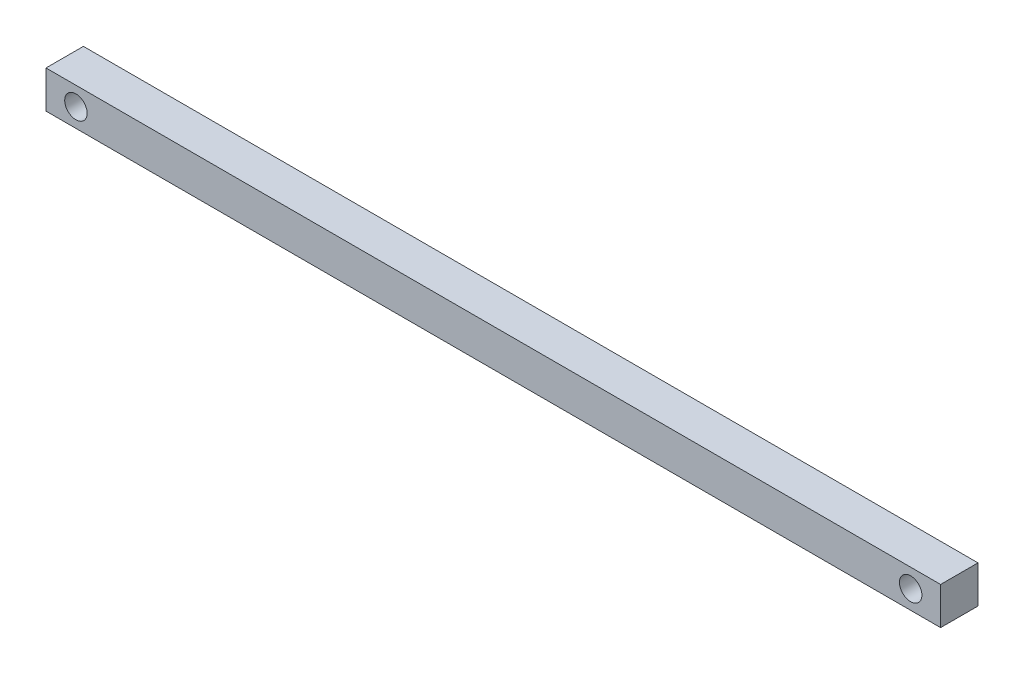
ISO-10303-21;
HEADER;
FILE_DESCRIPTION(('STEP AP214'),'2;1');
FILE_NAME('part.step','',(''),(''),'','','');
FILE_SCHEMA(('AUTOMOTIVE_DESIGN { 1 0 10303 214 1 1 1 1 }'));
ENDSEC;
DATA;
#1=APPLICATION_CONTEXT('core data for automotive mechanical design processes');
#2=APPLICATION_PROTOCOL_DEFINITION('international standard','automotive_design',2000,#1);
#3=PRODUCT_CONTEXT('',#1,'mechanical');
#4=PRODUCT('Part','Part','',(#3));
#5=PRODUCT_RELATED_PRODUCT_CATEGORY('part','',(#4));
#6=PRODUCT_DEFINITION_FORMATION('','',#4);
#7=PRODUCT_DEFINITION_CONTEXT('part definition',#1,'design');
#8=PRODUCT_DEFINITION('design','',#6,#7);
#9=PRODUCT_DEFINITION_SHAPE('','',#8);
#10=(LENGTH_UNIT() NAMED_UNIT(*) SI_UNIT(.MILLI.,.METRE.));
#11=(NAMED_UNIT(*) PLANE_ANGLE_UNIT() SI_UNIT($,.RADIAN.));
#12=(NAMED_UNIT(*) SI_UNIT($,.STERADIAN.) SOLID_ANGLE_UNIT());
#13=UNCERTAINTY_MEASURE_WITH_UNIT(LENGTH_MEASURE(1.E-05),#10,'distance_accuracy_value','');
#14=(GEOMETRIC_REPRESENTATION_CONTEXT(3) GLOBAL_UNCERTAINTY_ASSIGNED_CONTEXT((#13)) GLOBAL_UNIT_ASSIGNED_CONTEXT((#10,
#11,#12)) REPRESENTATION_CONTEXT('',''));
#15=CARTESIAN_POINT('',(0.,0.,0.));
#16=DIRECTION('',(0.,0.,1.));
#17=DIRECTION('',(1.,0.,0.));
#18=AXIS2_PLACEMENT_3D('',#15,#16,#17);
#19=CARTESIAN_POINT('',(299.,12.5,25.));
#20=DIRECTION('',(-1.,0.,0.));
#21=DIRECTION('',(0.,0.,1.));
#22=AXIS2_PLACEMENT_3D('',#19,#20,#21);
#23=PLANE('',#22);
#24=DIRECTION('',(0.,1.,0.));
#25=VECTOR('',#24,1.);
#26=CARTESIAN_POINT('',(299.,12.5,0.));
#27=LINE('',#26,#25);
#28=CARTESIAN_POINT('',(299.,-12.5,0.));
#29=VERTEX_POINT('',#28);
#30=CARTESIAN_POINT('',(299.,12.5,0.));
#31=VERTEX_POINT('',#30);
#32=EDGE_CURVE('E97',#29,#31,#27,.T.);
#33=ORIENTED_EDGE('',*,*,#32,.T.);
#34=DIRECTION('',(0.,0.,-1.));
#35=VECTOR('',#34,1.);
#36=CARTESIAN_POINT('',(299.,12.5,25.));
#37=LINE('',#36,#35);
#38=CARTESIAN_POINT('',(299.,12.5,25.));
#39=VERTEX_POINT('',#38);
#40=EDGE_CURVE('E11',#39,#31,#37,.T.);
#41=ORIENTED_EDGE('',*,*,#40,.F.);
#42=DIRECTION('',(0.,1.,0.));
#43=VECTOR('',#42,1.);
#44=CARTESIAN_POINT('',(299.,12.5,25.));
#45=LINE('',#44,#43);
#46=CARTESIAN_POINT('',(299.,-12.5,25.));
#47=VERTEX_POINT('',#46);
#48=EDGE_CURVE('E85',#47,#39,#45,.T.);
#49=ORIENTED_EDGE('',*,*,#48,.F.);
#50=DIRECTION('',(0.,0.,-1.));
#51=VECTOR('',#50,1.);
#52=CARTESIAN_POINT('',(299.,-12.5,25.));
#53=LINE('',#52,#51);
#54=EDGE_CURVE('E93',#47,#29,#53,.T.);
#55=ORIENTED_EDGE('',*,*,#54,.T.);
#56=EDGE_LOOP('',(#33,#41,#49,#55));
#57=FACE_BOUND('',#56,.T.);
#58=ADVANCED_FACE('F34',(#57),#23,.F.);
#59=CARTESIAN_POINT('',(-299.,12.5,25.));
#60=DIRECTION('',(0.,-1.,0.));
#61=DIRECTION('',(0.,0.,-1.));
#62=AXIS2_PLACEMENT_3D('',#59,#60,#61);
#63=PLANE('',#62);
#64=DIRECTION('',(-1.,0.,0.));
#65=VECTOR('',#64,1.);
#66=CARTESIAN_POINT('',(-299.,12.5,0.));
#67=LINE('',#66,#65);
#68=CARTESIAN_POINT('',(-299.,12.5,0.));
#69=VERTEX_POINT('',#68);
#70=EDGE_CURVE('E89',#31,#69,#67,.T.);
#71=ORIENTED_EDGE('',*,*,#70,.T.);
#72=DIRECTION('',(0.,0.,-1.));
#73=VECTOR('',#72,1.);
#74=CARTESIAN_POINT('',(-299.,12.5,25.));
#75=LINE('',#74,#73);
#76=CARTESIAN_POINT('',(-299.,12.5,25.));
#77=VERTEX_POINT('',#76);
#78=EDGE_CURVE('E42',#77,#69,#75,.T.);
#79=ORIENTED_EDGE('',*,*,#78,.F.);
#80=DIRECTION('',(-1.,0.,0.));
#81=VECTOR('',#80,1.);
#82=CARTESIAN_POINT('',(-299.,12.5,25.));
#83=LINE('',#82,#81);
#84=EDGE_CURVE('E80',#39,#77,#83,.T.);
#85=ORIENTED_EDGE('',*,*,#84,.F.);
#86=ORIENTED_EDGE('',*,*,#40,.T.);
#87=EDGE_LOOP('',(#71,#79,#85,#86));
#88=FACE_BOUND('',#87,.T.);
#89=ADVANCED_FACE('F88',(#88),#63,.F.);
#90=CARTESIAN_POINT('',(-299.,12.5,25.));
#91=DIRECTION('',(1.,0.,0.));
#92=DIRECTION('',(0.,0.,-1.));
#93=AXIS2_PLACEMENT_3D('',#90,#91,#92);
#94=PLANE('',#93);
#95=DIRECTION('',(0.,-1.,0.));
#96=VECTOR('',#95,1.);
#97=CARTESIAN_POINT('',(-299.,12.5,0.));
#98=LINE('',#97,#96);
#99=CARTESIAN_POINT('',(-299.,-12.5,0.));
#100=VERTEX_POINT('',#99);
#101=EDGE_CURVE('E67',#69,#100,#98,.T.);
#102=ORIENTED_EDGE('',*,*,#101,.T.);
#103=DIRECTION('',(0.,0.,-1.));
#104=VECTOR('',#103,1.);
#105=CARTESIAN_POINT('',(-299.,-12.5,25.));
#106=LINE('',#105,#104);
#107=CARTESIAN_POINT('',(-299.,-12.5,25.));
#108=VERTEX_POINT('',#107);
#109=EDGE_CURVE('E90',#108,#100,#106,.T.);
#110=ORIENTED_EDGE('',*,*,#109,.F.);
#111=DIRECTION('',(0.,-1.,0.));
#112=VECTOR('',#111,1.);
#113=CARTESIAN_POINT('',(-299.,12.5,25.));
#114=LINE('',#113,#112);
#115=EDGE_CURVE('E83',#77,#108,#114,.T.);
#116=ORIENTED_EDGE('',*,*,#115,.F.);
#117=ORIENTED_EDGE('',*,*,#78,.T.);
#118=EDGE_LOOP('',(#102,#110,#116,#117));
#119=FACE_BOUND('',#118,.T.);
#120=ADVANCED_FACE('F91',(#119),#94,.F.);
#121=CARTESIAN_POINT('',(-299.,-12.5,25.));
#122=DIRECTION('',(0.,1.,0.));
#123=DIRECTION('',(0.,0.,1.));
#124=AXIS2_PLACEMENT_3D('',#121,#122,#123);
#125=PLANE('',#124);
#126=DIRECTION('',(1.,0.,0.));
#127=VECTOR('',#126,1.);
#128=CARTESIAN_POINT('',(-299.,-12.5,0.));
#129=LINE('',#128,#127);
#130=EDGE_CURVE('E73',#100,#29,#129,.T.);
#131=ORIENTED_EDGE('',*,*,#130,.T.);
#132=ORIENTED_EDGE('',*,*,#54,.F.);
#133=DIRECTION('',(1.,0.,0.));
#134=VECTOR('',#133,1.);
#135=CARTESIAN_POINT('',(-299.,-12.5,25.));
#136=LINE('',#135,#134);
#137=EDGE_CURVE('E50',#108,#47,#136,.T.);
#138=ORIENTED_EDGE('',*,*,#137,.F.);
#139=ORIENTED_EDGE('',*,*,#109,.T.);
#140=EDGE_LOOP('',(#131,#132,#138,#139));
#141=FACE_BOUND('',#140,.T.);
#142=ADVANCED_FACE('F105',(#141),#125,.F.);
#143=CARTESIAN_POINT('',(0.,0.,25.));
#144=DIRECTION('',(0.,0.,1.));
#145=DIRECTION('',(1.,0.,0.));
#146=AXIS2_PLACEMENT_3D('',#143,#144,#145);
#147=PLANE('',#146);
#148=CARTESIAN_POINT('',(-279.,0.,25.));
#149=DIRECTION('',(0.,0.,1.));
#150=DIRECTION('',(1.,0.,0.));
#151=AXIS2_PLACEMENT_3D('',#148,#149,#150);
#152=CIRCLE('',#151,7.50000000000001);
#153=CARTESIAN_POINT('',(-271.5,0.,25.));
#154=VERTEX_POINT('',#153);
#155=EDGE_CURVE('E100',#154,#154,#152,.T.);
#156=ORIENTED_EDGE('',*,*,#155,.F.);
#157=EDGE_LOOP('',(#156));
#158=FACE_BOUND('',#157,.T.);
#159=CARTESIAN_POINT('',(279.,0.,25.));
#160=DIRECTION('',(0.,0.,1.));
#161=DIRECTION('',(1.,0.,0.));
#162=AXIS2_PLACEMENT_3D('',#159,#160,#161);
#163=CIRCLE('',#162,7.50000000000001);
#164=CARTESIAN_POINT('',(286.5,0.,25.));
#165=VERTEX_POINT('',#164);
#166=EDGE_CURVE('E113',#165,#165,#163,.T.);
#167=ORIENTED_EDGE('',*,*,#166,.F.);
#168=EDGE_LOOP('',(#167));
#169=FACE_BOUND('',#168,.T.);
#170=ORIENTED_EDGE('',*,*,#48,.T.);
#171=ORIENTED_EDGE('',*,*,#84,.T.);
#172=ORIENTED_EDGE('',*,*,#115,.T.);
#173=ORIENTED_EDGE('',*,*,#137,.T.);
#174=EDGE_LOOP('',(#170,#171,#172,#173));
#175=FACE_BOUND('',#174,.T.);
#176=ADVANCED_FACE('F81',(#158,#169,#175),#147,.T.);
#177=CARTESIAN_POINT('',(0.,0.,0.));
#178=DIRECTION('',(0.,0.,1.));
#179=DIRECTION('',(1.,0.,0.));
#180=AXIS2_PLACEMENT_3D('',#177,#178,#179);
#181=PLANE('',#180);
#182=CARTESIAN_POINT('',(-279.,0.,0.));
#183=DIRECTION('',(0.,0.,1.));
#184=DIRECTION('',(1.,0.,0.));
#185=AXIS2_PLACEMENT_3D('',#182,#183,#184);
#186=CIRCLE('',#185,7.50000000000001);
#187=CARTESIAN_POINT('',(-271.5,0.,0.));
#188=VERTEX_POINT('',#187);
#189=EDGE_CURVE('E116',#188,#188,#186,.T.);
#190=ORIENTED_EDGE('',*,*,#189,.T.);
#191=EDGE_LOOP('',(#190));
#192=FACE_BOUND('',#191,.T.);
#193=CARTESIAN_POINT('',(279.,0.,0.));
#194=DIRECTION('',(0.,0.,1.));
#195=DIRECTION('',(1.,0.,0.));
#196=AXIS2_PLACEMENT_3D('',#193,#194,#195);
#197=CIRCLE('',#196,7.50000000000001);
#198=CARTESIAN_POINT('',(286.5,0.,0.));
#199=VERTEX_POINT('',#198);
#200=EDGE_CURVE('E117',#199,#199,#197,.T.);
#201=ORIENTED_EDGE('',*,*,#200,.T.);
#202=EDGE_LOOP('',(#201));
#203=FACE_BOUND('',#202,.T.);
#204=ORIENTED_EDGE('',*,*,#32,.F.);
#205=ORIENTED_EDGE('',*,*,#130,.F.);
#206=ORIENTED_EDGE('',*,*,#101,.F.);
#207=ORIENTED_EDGE('',*,*,#70,.F.);
#208=EDGE_LOOP('',(#204,#205,#206,#207));
#209=FACE_BOUND('',#208,.T.);
#210=ADVANCED_FACE('F108',(#192,#203,#209),#181,.F.);
#211=CARTESIAN_POINT('',(279.,0.,0.));
#212=DIRECTION('',(0.,0.,1.));
#213=DIRECTION('',(1.,0.,0.));
#214=AXIS2_PLACEMENT_3D('',#211,#212,#213);
#215=CYLINDRICAL_SURFACE('',#214,7.50000000000001);
#216=ORIENTED_EDGE('',*,*,#166,.T.);
#217=EDGE_LOOP('',(#216));
#218=FACE_BOUND('',#217,.T.);
#219=ORIENTED_EDGE('',*,*,#200,.F.);
#220=EDGE_LOOP('',(#219));
#221=FACE_BOUND('',#220,.T.);
#222=ADVANCED_FACE('F127',(#218,#221),#215,.F.);
#223=CARTESIAN_POINT('',(-279.,0.,0.));
#224=DIRECTION('',(0.,0.,1.));
#225=DIRECTION('',(1.,0.,0.));
#226=AXIS2_PLACEMENT_3D('',#223,#224,#225);
#227=CYLINDRICAL_SURFACE('',#226,7.50000000000001);
#228=ORIENTED_EDGE('',*,*,#155,.T.);
#229=EDGE_LOOP('',(#228));
#230=FACE_BOUND('',#229,.T.);
#231=ORIENTED_EDGE('',*,*,#189,.F.);
#232=EDGE_LOOP('',(#231));
#233=FACE_BOUND('',#232,.T.);
#234=ADVANCED_FACE('F125',(#230,#233),#227,.F.);
#235=CLOSED_SHELL('',(#58,#89,#120,#142,#176,#210,#222,#234));
#236=MANIFOLD_SOLID_BREP('B2',#235);
#237=ADVANCED_BREP_SHAPE_REPRESENTATION('',(#18,#236),#14);
#238=SHAPE_DEFINITION_REPRESENTATION(#9,#237);
ENDSEC;
END-ISO-10303-21;
